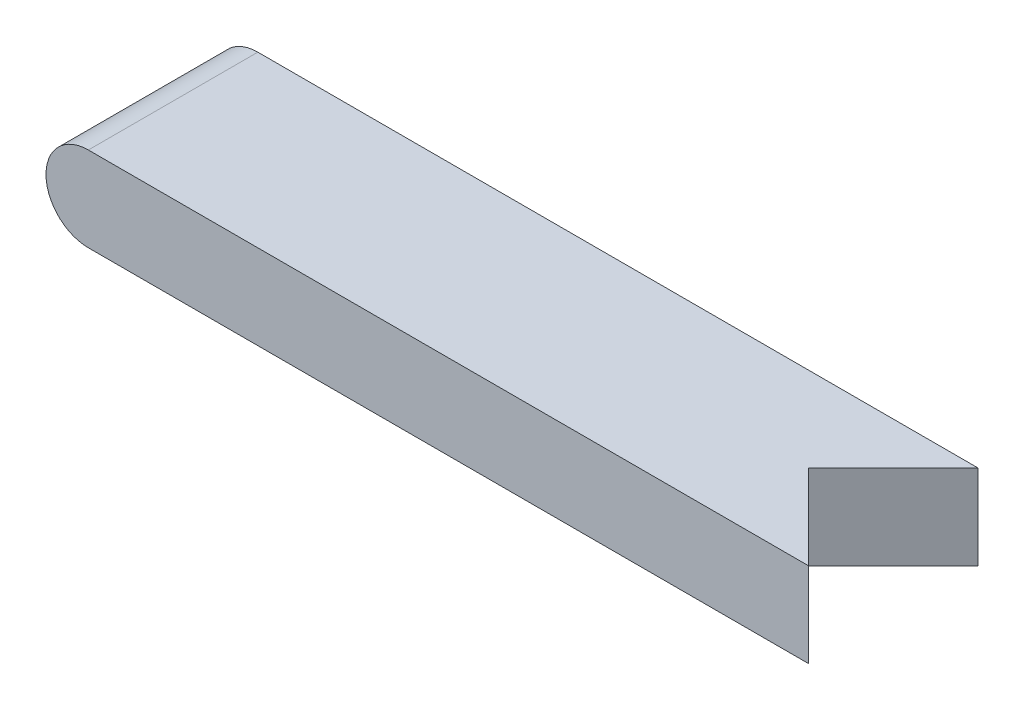
ISO-10303-21;
HEADER;
FILE_DESCRIPTION(('STEP AP214'),'2;1');
FILE_NAME('part.step','',(''),(''),'','','');
FILE_SCHEMA(('AUTOMOTIVE_DESIGN { 1 0 10303 214 1 1 1 1 }'));
ENDSEC;
DATA;
#1=APPLICATION_CONTEXT('core data for automotive mechanical design processes');
#2=APPLICATION_PROTOCOL_DEFINITION('international standard','automotive_design',2000,#1);
#3=PRODUCT_CONTEXT('',#1,'mechanical');
#4=PRODUCT('Part','Part','',(#3));
#5=PRODUCT_RELATED_PRODUCT_CATEGORY('part','',(#4));
#6=PRODUCT_DEFINITION_FORMATION('','',#4);
#7=PRODUCT_DEFINITION_CONTEXT('part definition',#1,'design');
#8=PRODUCT_DEFINITION('design','',#6,#7);
#9=PRODUCT_DEFINITION_SHAPE('','',#8);
#10=(LENGTH_UNIT() NAMED_UNIT(*) SI_UNIT(.MILLI.,.METRE.));
#11=(NAMED_UNIT(*) PLANE_ANGLE_UNIT() SI_UNIT($,.RADIAN.));
#12=(NAMED_UNIT(*) SI_UNIT($,.STERADIAN.) SOLID_ANGLE_UNIT());
#13=UNCERTAINTY_MEASURE_WITH_UNIT(LENGTH_MEASURE(1.E-05),#10,'distance_accuracy_value','');
#14=(GEOMETRIC_REPRESENTATION_CONTEXT(3) GLOBAL_UNCERTAINTY_ASSIGNED_CONTEXT((#13)) GLOBAL_UNIT_ASSIGNED_CONTEXT((#10,
#11,#12)) REPRESENTATION_CONTEXT('',''));
#15=CARTESIAN_POINT('',(0.,0.,0.));
#16=DIRECTION('',(0.,0.,1.));
#17=DIRECTION('',(1.,0.,0.));
#18=AXIS2_PLACEMENT_3D('',#15,#16,#17);
#19=CARTESIAN_POINT('',(12.7,2.54,0.));
#20=DIRECTION('',(0.,0.,-1.));
#21=DIRECTION('',(-1.,0.,0.));
#22=AXIS2_PLACEMENT_3D('',#19,#20,#21);
#23=PLANE('',#22);
#24=CARTESIAN_POINT('',(-8.89,1.27,0.));
#25=DIRECTION('',(0.,0.,-1.));
#26=DIRECTION('',(-1.,0.,0.));
#27=AXIS2_PLACEMENT_3D('',#24,#25,#26);
#28=CIRCLE('',#27,1.27);
#29=CARTESIAN_POINT('',(-8.89,2.54,0.));
#30=VERTEX_POINT('',#29);
#31=CARTESIAN_POINT('',(-10.16,1.27,0.));
#32=VERTEX_POINT('',#31);
#33=EDGE_CURVE('E118',#30,#32,#28,.F.);
#34=ORIENTED_EDGE('',*,*,#33,.T.);
#35=CARTESIAN_POINT('',(-8.89,1.27,0.));
#36=DIRECTION('',(0.,0.,-1.));
#37=DIRECTION('',(-1.,0.,0.));
#38=AXIS2_PLACEMENT_3D('',#35,#36,#37);
#39=CIRCLE('',#38,1.27);
#40=CARTESIAN_POINT('',(-8.89,0.,0.));
#41=VERTEX_POINT('',#40);
#42=EDGE_CURVE('E120',#32,#41,#39,.F.);
#43=ORIENTED_EDGE('',*,*,#42,.T.);
#44=DIRECTION('',(1.,0.,0.));
#45=VECTOR('',#44,1.);
#46=CARTESIAN_POINT('',(12.7,0.,0.));
#47=LINE('',#46,#45);
#48=CARTESIAN_POINT('',(12.7,0.,0.));
#49=VERTEX_POINT('',#48);
#50=EDGE_CURVE('E109',#41,#49,#47,.T.);
#51=ORIENTED_EDGE('',*,*,#50,.T.);
#52=DIRECTION('',(0.,-1.,0.));
#53=VECTOR('',#52,1.);
#54=CARTESIAN_POINT('',(12.7,2.54,0.));
#55=LINE('',#54,#53);
#56=CARTESIAN_POINT('',(12.7,2.54,0.));
#57=VERTEX_POINT('',#56);
#58=EDGE_CURVE('E101',#57,#49,#55,.T.);
#59=ORIENTED_EDGE('',*,*,#58,.F.);
#60=DIRECTION('',(1.,0.,0.));
#61=VECTOR('',#60,1.);
#62=CARTESIAN_POINT('',(-10.16,2.54,0.));
#63=LINE('',#62,#61);
#64=EDGE_CURVE('E108',#30,#57,#63,.T.);
#65=ORIENTED_EDGE('',*,*,#64,.F.);
#66=EDGE_LOOP('',(#34,#43,#51,#59,#65));
#67=FACE_BOUND('',#66,.T.);
#68=ADVANCED_FACE('F33',(#67),#23,.F.);
#69=CARTESIAN_POINT('',(12.7,2.54,-5.08));
#70=DIRECTION('',(0.,0.,1.));
#71=DIRECTION('',(1.,0.,0.));
#72=AXIS2_PLACEMENT_3D('',#69,#70,#71);
#73=PLANE('',#72);
#74=DIRECTION('',(-1.,0.,0.));
#75=VECTOR('',#74,1.);
#76=CARTESIAN_POINT('',(12.7,0.,-5.08));
#77=LINE('',#76,#75);
#78=CARTESIAN_POINT('',(12.7,0.,-5.08));
#79=VERTEX_POINT('',#78);
#80=CARTESIAN_POINT('',(-8.89,0.,-5.08));
#81=VERTEX_POINT('',#80);
#82=EDGE_CURVE('E99',#79,#81,#77,.T.);
#83=ORIENTED_EDGE('',*,*,#82,.T.);
#84=CARTESIAN_POINT('',(-8.89,1.27,-5.08));
#85=DIRECTION('',(0.,0.,1.));
#86=DIRECTION('',(1.,0.,0.));
#87=AXIS2_PLACEMENT_3D('',#84,#85,#86);
#88=CIRCLE('',#87,1.27);
#89=CARTESIAN_POINT('',(-10.16,1.27,-5.08));
#90=VERTEX_POINT('',#89);
#91=EDGE_CURVE('E42',#81,#90,#88,.F.);
#92=ORIENTED_EDGE('',*,*,#91,.T.);
#93=CARTESIAN_POINT('',(-8.89,1.27,-5.08));
#94=DIRECTION('',(0.,0.,1.));
#95=DIRECTION('',(1.,0.,0.));
#96=AXIS2_PLACEMENT_3D('',#93,#94,#95);
#97=CIRCLE('',#96,1.27);
#98=CARTESIAN_POINT('',(-8.89,2.54,-5.08));
#99=VERTEX_POINT('',#98);
#100=EDGE_CURVE('E57',#90,#99,#97,.F.);
#101=ORIENTED_EDGE('',*,*,#100,.T.);
#102=DIRECTION('',(-1.,0.,0.));
#103=VECTOR('',#102,1.);
#104=CARTESIAN_POINT('',(12.7,2.54,-5.08));
#105=LINE('',#104,#103);
#106=CARTESIAN_POINT('',(12.7,2.54,-5.08));
#107=VERTEX_POINT('',#106);
#108=EDGE_CURVE('E100',#107,#99,#105,.T.);
#109=ORIENTED_EDGE('',*,*,#108,.F.);
#110=DIRECTION('',(0.,-1.,0.));
#111=VECTOR('',#110,1.);
#112=CARTESIAN_POINT('',(12.7,2.54,-5.08));
#113=LINE('',#112,#111);
#114=EDGE_CURVE('E90',#107,#79,#113,.T.);
#115=ORIENTED_EDGE('',*,*,#114,.T.);
#116=EDGE_LOOP('',(#83,#92,#101,#109,#115));
#117=FACE_BOUND('',#116,.T.);
#118=ADVANCED_FACE('F98',(#117),#73,.F.);
#119=CARTESIAN_POINT('',(0.,2.54,0.));
#120=DIRECTION('',(0.,1.,0.));
#121=DIRECTION('',(0.,0.,1.));
#122=AXIS2_PLACEMENT_3D('',#119,#120,#121);
#123=PLANE('',#122);
#124=DIRECTION('',(0.707106781186541,0.,0.707106781186554));
#125=VECTOR('',#124,1.);
#126=CARTESIAN_POINT('',(10.16,2.54,-2.54));
#127=LINE('',#126,#125);
#128=CARTESIAN_POINT('',(10.16,2.54,-2.54));
#129=VERTEX_POINT('',#128);
#130=EDGE_CURVE('E95',#129,#57,#127,.T.);
#131=ORIENTED_EDGE('',*,*,#130,.F.);
#132=DIRECTION('',(-0.707106781186541,0.,0.707106781186554));
#133=VECTOR('',#132,1.);
#134=CARTESIAN_POINT('',(12.7,2.54,-5.08));
#135=LINE('',#134,#133);
#136=EDGE_CURVE('E140',#107,#129,#135,.T.);
#137=ORIENTED_EDGE('',*,*,#136,.F.);
#138=ORIENTED_EDGE('',*,*,#108,.T.);
#139=DIRECTION('',(0.,0.,1.));
#140=VECTOR('',#139,1.);
#141=CARTESIAN_POINT('',(-8.89,2.54,0.));
#142=LINE('',#141,#140);
#143=EDGE_CURVE('E11',#99,#30,#142,.T.);
#144=ORIENTED_EDGE('',*,*,#143,.T.);
#145=ORIENTED_EDGE('',*,*,#64,.T.);
#146=EDGE_LOOP('',(#131,#137,#138,#144,#145));
#147=FACE_BOUND('',#146,.T.);
#148=ADVANCED_FACE('F138',(#147),#123,.T.);
#149=CARTESIAN_POINT('',(0.,0.,0.));
#150=DIRECTION('',(0.,1.,0.));
#151=DIRECTION('',(0.,0.,1.));
#152=AXIS2_PLACEMENT_3D('',#149,#150,#151);
#153=PLANE('',#152);
#154=DIRECTION('',(-0.707106781186541,0.,0.707106781186554));
#155=VECTOR('',#154,1.);
#156=CARTESIAN_POINT('',(12.7,0.,-5.08));
#157=LINE('',#156,#155);
#158=CARTESIAN_POINT('',(10.16,0.,-2.54));
#159=VERTEX_POINT('',#158);
#160=EDGE_CURVE('E86',#79,#159,#157,.T.);
#161=ORIENTED_EDGE('',*,*,#160,.T.);
#162=DIRECTION('',(0.707106781186541,0.,0.707106781186554));
#163=VECTOR('',#162,1.);
#164=CARTESIAN_POINT('',(10.16,0.,-2.54));
#165=LINE('',#164,#163);
#166=EDGE_CURVE('E49',#159,#49,#165,.T.);
#167=ORIENTED_EDGE('',*,*,#166,.T.);
#168=ORIENTED_EDGE('',*,*,#50,.F.);
#169=DIRECTION('',(0.,0.,1.));
#170=VECTOR('',#169,1.);
#171=CARTESIAN_POINT('',(-8.89,0.,0.));
#172=LINE('',#171,#170);
#173=EDGE_CURVE('E107',#41,#81,#172,.F.);
#174=ORIENTED_EDGE('',*,*,#173,.T.);
#175=ORIENTED_EDGE('',*,*,#82,.F.);
#176=EDGE_LOOP('',(#161,#167,#168,#174,#175));
#177=FACE_BOUND('',#176,.T.);
#178=ADVANCED_FACE('F104',(#177),#153,.F.);
#179=CARTESIAN_POINT('',(-8.89,1.27,0.));
#180=DIRECTION('',(0.,0.,-1.));
#181=DIRECTION('',(-1.,0.,0.));
#182=AXIS2_PLACEMENT_3D('',#179,#180,#181);
#183=CYLINDRICAL_SURFACE('',#182,1.27);
#184=ORIENTED_EDGE('',*,*,#143,.F.);
#185=ORIENTED_EDGE('',*,*,#100,.F.);
#186=DIRECTION('',(0.,0.,1.));
#187=VECTOR('',#186,1.);
#188=CARTESIAN_POINT('',(-10.16,1.27,-5.08));
#189=LINE('',#188,#187);
#190=EDGE_CURVE('E37',#32,#90,#189,.F.);
#191=ORIENTED_EDGE('',*,*,#190,.F.);
#192=ORIENTED_EDGE('',*,*,#33,.F.);
#193=EDGE_LOOP('',(#184,#185,#191,#192));
#194=FACE_BOUND('',#193,.T.);
#195=ADVANCED_FACE('F35',(#194),#183,.T.);
#196=CARTESIAN_POINT('',(-8.89,1.27,-5.08));
#197=DIRECTION('',(0.,0.,1.));
#198=DIRECTION('',(1.,0.,0.));
#199=AXIS2_PLACEMENT_3D('',#196,#197,#198);
#200=CYLINDRICAL_SURFACE('',#199,1.27);
#201=ORIENTED_EDGE('',*,*,#91,.F.);
#202=ORIENTED_EDGE('',*,*,#173,.F.);
#203=ORIENTED_EDGE('',*,*,#42,.F.);
#204=ORIENTED_EDGE('',*,*,#190,.T.);
#205=EDGE_LOOP('',(#201,#202,#203,#204));
#206=FACE_BOUND('',#205,.T.);
#207=ADVANCED_FACE('F131',(#206),#200,.T.);
#208=CARTESIAN_POINT('',(10.16,0.,-2.54));
#209=DIRECTION('',(-0.707106781186554,0.,0.707106781186541));
#210=DIRECTION('',(0.707106781186541,0.,0.707106781186554));
#211=AXIS2_PLACEMENT_3D('',#208,#209,#210);
#212=PLANE('',#211);
#213=ORIENTED_EDGE('',*,*,#130,.T.);
#214=ORIENTED_EDGE('',*,*,#58,.T.);
#215=ORIENTED_EDGE('',*,*,#166,.F.);
#216=DIRECTION('',(0.,1.,0.));
#217=VECTOR('',#216,1.);
#218=CARTESIAN_POINT('',(10.16,0.,-2.54));
#219=LINE('',#218,#217);
#220=EDGE_CURVE('E92',#159,#129,#219,.T.);
#221=ORIENTED_EDGE('',*,*,#220,.T.);
#222=EDGE_LOOP('',(#213,#214,#215,#221));
#223=FACE_BOUND('',#222,.T.);
#224=ADVANCED_FACE('F141',(#223),#212,.F.);
#225=CARTESIAN_POINT('',(12.7,0.,-5.08));
#226=DIRECTION('',(-0.707106781186554,0.,-0.707106781186541));
#227=DIRECTION('',(-0.707106781186541,0.,0.707106781186554));
#228=AXIS2_PLACEMENT_3D('',#225,#226,#227);
#229=PLANE('',#228);
#230=ORIENTED_EDGE('',*,*,#136,.T.);
#231=ORIENTED_EDGE('',*,*,#220,.F.);
#232=ORIENTED_EDGE('',*,*,#160,.F.);
#233=ORIENTED_EDGE('',*,*,#114,.F.);
#234=EDGE_LOOP('',(#230,#231,#232,#233));
#235=FACE_BOUND('',#234,.T.);
#236=ADVANCED_FACE('F89',(#235),#229,.F.);
#237=CLOSED_SHELL('',(#68,#118,#148,#178,#195,#207,#224,#236));
#238=MANIFOLD_SOLID_BREP('B2',#237);
#239=ADVANCED_BREP_SHAPE_REPRESENTATION('',(#18,#238),#14);
#240=SHAPE_DEFINITION_REPRESENTATION(#9,#239);
ENDSEC;
END-ISO-10303-21;
